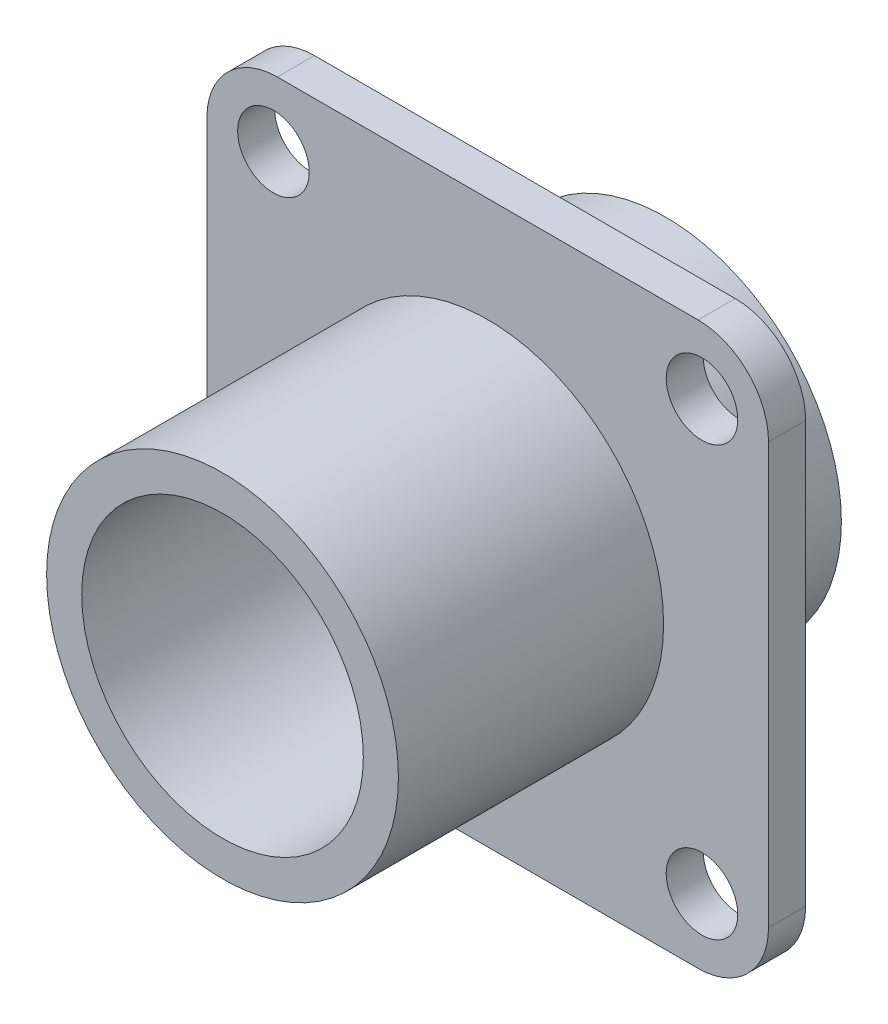
ISO-10303-21;
HEADER;
FILE_DESCRIPTION(('STEP AP214'),'2;1');
FILE_NAME('part.step','',(''),(''),'','','');
FILE_SCHEMA(('AUTOMOTIVE_DESIGN { 1 0 10303 214 1 1 1 1 }'));
ENDSEC;
DATA;
#1=APPLICATION_CONTEXT('core data for automotive mechanical design processes');
#2=APPLICATION_PROTOCOL_DEFINITION('international standard','automotive_design',2000,#1);
#3=PRODUCT_CONTEXT('',#1,'mechanical');
#4=PRODUCT('Part','Part','',(#3));
#5=PRODUCT_RELATED_PRODUCT_CATEGORY('part','',(#4));
#6=PRODUCT_DEFINITION_FORMATION('','',#4);
#7=PRODUCT_DEFINITION_CONTEXT('part definition',#1,'design');
#8=PRODUCT_DEFINITION('design','',#6,#7);
#9=PRODUCT_DEFINITION_SHAPE('','',#8);
#10=(LENGTH_UNIT() NAMED_UNIT(*) SI_UNIT(.MILLI.,.METRE.));
#11=(NAMED_UNIT(*) PLANE_ANGLE_UNIT() SI_UNIT($,.RADIAN.));
#12=(NAMED_UNIT(*) SI_UNIT($,.STERADIAN.) SOLID_ANGLE_UNIT());
#13=UNCERTAINTY_MEASURE_WITH_UNIT(LENGTH_MEASURE(1.E-05),#10,'distance_accuracy_value','');
#14=(GEOMETRIC_REPRESENTATION_CONTEXT(3) GLOBAL_UNCERTAINTY_ASSIGNED_CONTEXT((#13)) GLOBAL_UNIT_ASSIGNED_CONTEXT((#10,
#11,#12)) REPRESENTATION_CONTEXT('',''));
#15=CARTESIAN_POINT('',(0.,0.,0.));
#16=DIRECTION('',(0.,0.,1.));
#17=DIRECTION('',(1.,0.,0.));
#18=AXIS2_PLACEMENT_3D('',#15,#16,#17);
#19=CARTESIAN_POINT('',(0.,0.,0.));
#20=DIRECTION('',(0.,0.,-1.));
#21=DIRECTION('',(-1.,0.,0.));
#22=AXIS2_PLACEMENT_3D('',#19,#20,#21);
#23=CYLINDRICAL_SURFACE('',#22,7.49);
#24=CARTESIAN_POINT('',(0.,0.,0.));
#25=DIRECTION('',(0.,0.,-1.));
#26=DIRECTION('',(-1.,0.,0.));
#27=AXIS2_PLACEMENT_3D('',#24,#25,#26);
#28=CIRCLE('',#27,7.49);
#29=CARTESIAN_POINT('',(-7.49,0.,0.));
#30=VERTEX_POINT('',#29);
#31=EDGE_CURVE('E134',#30,#30,#28,.T.);
#32=ORIENTED_EDGE('',*,*,#31,.T.);
#33=EDGE_LOOP('',(#32));
#34=FACE_BOUND('',#33,.T.);
#35=CARTESIAN_POINT('',(0.,0.,-6.));
#36=DIRECTION('',(0.,0.,-1.));
#37=DIRECTION('',(-1.,0.,0.));
#38=AXIS2_PLACEMENT_3D('',#35,#36,#37);
#39=CIRCLE('',#38,7.49);
#40=CARTESIAN_POINT('',(-7.49,0.,-6.));
#41=VERTEX_POINT('',#40);
#42=EDGE_CURVE('E218',#41,#41,#39,.T.);
#43=ORIENTED_EDGE('',*,*,#42,.F.);
#44=EDGE_LOOP('',(#43));
#45=FACE_BOUND('',#44,.T.);
#46=ADVANCED_FACE('F41',(#34,#45),#23,.T.);
#47=CARTESIAN_POINT('',(0.,0.,12.88));
#48=DIRECTION('',(0.,0.,1.));
#49=DIRECTION('',(1.,0.,0.));
#50=AXIS2_PLACEMENT_3D('',#47,#48,#49);
#51=CYLINDRICAL_SURFACE('',#50,5.99999999999999);
#52=CARTESIAN_POINT('',(0.,0.,12.88));
#53=DIRECTION('',(0.,0.,1.));
#54=DIRECTION('',(1.,0.,0.));
#55=AXIS2_PLACEMENT_3D('',#52,#53,#54);
#56=CIRCLE('',#55,5.99999999999999);
#57=CARTESIAN_POINT('',(5.99999999999999,0.,12.88));
#58=VERTEX_POINT('',#57);
#59=EDGE_CURVE('E215',#58,#58,#56,.T.);
#60=ORIENTED_EDGE('',*,*,#59,.T.);
#61=EDGE_LOOP('',(#60));
#62=FACE_BOUND('',#61,.T.);
#63=CARTESIAN_POINT('',(0.,0.,-6.));
#64=DIRECTION('',(0.,0.,-1.));
#65=DIRECTION('',(-1.,0.,0.));
#66=AXIS2_PLACEMENT_3D('',#63,#64,#65);
#67=CIRCLE('',#66,5.99999999999999);
#68=CARTESIAN_POINT('',(-5.99999999999999,0.,-6.));
#69=VERTEX_POINT('',#68);
#70=EDGE_CURVE('E45',#69,#69,#67,.F.);
#71=ORIENTED_EDGE('',*,*,#70,.F.);
#72=EDGE_LOOP('',(#71));
#73=FACE_BOUND('',#72,.T.);
#74=ADVANCED_FACE('F227',(#62,#73),#51,.F.);
#75=CARTESIAN_POINT('',(11.965,-11.965,1.58));
#76=DIRECTION('',(0.,-1.,0.));
#77=DIRECTION('',(1.,0.,0.));
#78=AXIS2_PLACEMENT_3D('',#75,#76,#77);
#79=PLANE('',#78);
#80=DIRECTION('',(-1.,0.,0.));
#81=VECTOR('',#80,1.);
#82=CARTESIAN_POINT('',(11.965,-11.965,1.58));
#83=LINE('',#82,#81);
#84=CARTESIAN_POINT('',(8.965,-11.965,1.58));
#85=VERTEX_POINT('',#84);
#86=CARTESIAN_POINT('',(-8.96499999999999,-11.965,1.58));
#87=VERTEX_POINT('',#86);
#88=EDGE_CURVE('E167',#85,#87,#83,.T.);
#89=ORIENTED_EDGE('',*,*,#88,.T.);
#90=DIRECTION('',(0.,0.,-1.));
#91=VECTOR('',#90,1.);
#92=CARTESIAN_POINT('',(-8.96499999999999,-11.965,1.58));
#93=LINE('',#92,#91);
#94=CARTESIAN_POINT('',(-8.96499999999999,-11.965,0.));
#95=VERTEX_POINT('',#94);
#96=EDGE_CURVE('E12',#87,#95,#93,.T.);
#97=ORIENTED_EDGE('',*,*,#96,.T.);
#98=DIRECTION('',(-1.,0.,0.));
#99=VECTOR('',#98,1.);
#100=CARTESIAN_POINT('',(11.965,-11.965,0.));
#101=LINE('',#100,#99);
#102=CARTESIAN_POINT('',(8.965,-11.965,0.));
#103=VERTEX_POINT('',#102);
#104=EDGE_CURVE('E114',#103,#95,#101,.T.);
#105=ORIENTED_EDGE('',*,*,#104,.F.);
#106=DIRECTION('',(0.,0.,-1.));
#107=VECTOR('',#106,1.);
#108=CARTESIAN_POINT('',(8.965,-11.965,1.58));
#109=LINE('',#108,#107);
#110=EDGE_CURVE('E50',#103,#85,#109,.F.);
#111=ORIENTED_EDGE('',*,*,#110,.T.);
#112=EDGE_LOOP('',(#89,#97,#105,#111));
#113=FACE_BOUND('',#112,.T.);
#114=ADVANCED_FACE('F166',(#113),#79,.T.);
#115=CARTESIAN_POINT('',(11.965,11.965,1.58));
#116=DIRECTION('',(1.,0.,0.));
#117=DIRECTION('',(0.,1.,0.));
#118=AXIS2_PLACEMENT_3D('',#115,#116,#117);
#119=PLANE('',#118);
#120=DIRECTION('',(0.,-1.,0.));
#121=VECTOR('',#120,1.);
#122=CARTESIAN_POINT('',(11.965,11.965,0.));
#123=LINE('',#122,#121);
#124=CARTESIAN_POINT('',(11.965,8.965,0.));
#125=VERTEX_POINT('',#124);
#126=CARTESIAN_POINT('',(11.965,-8.96499999999999,0.));
#127=VERTEX_POINT('',#126);
#128=EDGE_CURVE('E141',#125,#127,#123,.T.);
#129=ORIENTED_EDGE('',*,*,#128,.F.);
#130=DIRECTION('',(0.,0.,-1.));
#131=VECTOR('',#130,1.);
#132=CARTESIAN_POINT('',(11.965,8.965,1.58));
#133=LINE('',#132,#131);
#134=CARTESIAN_POINT('',(11.965,8.965,1.58));
#135=VERTEX_POINT('',#134);
#136=EDGE_CURVE('E64',#125,#135,#133,.F.);
#137=ORIENTED_EDGE('',*,*,#136,.T.);
#138=DIRECTION('',(0.,-1.,0.));
#139=VECTOR('',#138,1.);
#140=CARTESIAN_POINT('',(11.965,11.965,1.58));
#141=LINE('',#140,#139);
#142=CARTESIAN_POINT('',(11.965,-8.96499999999999,1.58));
#143=VERTEX_POINT('',#142);
#144=EDGE_CURVE('E176',#135,#143,#141,.T.);
#145=ORIENTED_EDGE('',*,*,#144,.T.);
#146=DIRECTION('',(0.,0.,-1.));
#147=VECTOR('',#146,1.);
#148=CARTESIAN_POINT('',(11.965,-8.965,1.58));
#149=LINE('',#148,#147);
#150=EDGE_CURVE('E159',#143,#127,#149,.T.);
#151=ORIENTED_EDGE('',*,*,#150,.T.);
#152=EDGE_LOOP('',(#129,#137,#145,#151));
#153=FACE_BOUND('',#152,.T.);
#154=ADVANCED_FACE('F175',(#153),#119,.T.);
#155=CARTESIAN_POINT('',(-11.965,11.965,1.58));
#156=DIRECTION('',(0.,1.,0.));
#157=DIRECTION('',(-1.,0.,0.));
#158=AXIS2_PLACEMENT_3D('',#155,#156,#157);
#159=PLANE('',#158);
#160=DIRECTION('',(1.,0.,0.));
#161=VECTOR('',#160,1.);
#162=CARTESIAN_POINT('',(-11.965,11.965,0.));
#163=LINE('',#162,#161);
#164=CARTESIAN_POINT('',(-8.965,11.965,0.));
#165=VERTEX_POINT('',#164);
#166=CARTESIAN_POINT('',(8.96499999999999,11.965,0.));
#167=VERTEX_POINT('',#166);
#168=EDGE_CURVE('E129',#165,#167,#163,.T.);
#169=ORIENTED_EDGE('',*,*,#168,.F.);
#170=DIRECTION('',(0.,0.,-1.));
#171=VECTOR('',#170,1.);
#172=CARTESIAN_POINT('',(-8.965,11.965,1.58));
#173=LINE('',#172,#171);
#174=CARTESIAN_POINT('',(-8.965,11.965,1.58));
#175=VERTEX_POINT('',#174);
#176=EDGE_CURVE('E151',#165,#175,#173,.F.);
#177=ORIENTED_EDGE('',*,*,#176,.T.);
#178=DIRECTION('',(1.,0.,0.));
#179=VECTOR('',#178,1.);
#180=CARTESIAN_POINT('',(-11.965,11.965,1.58));
#181=LINE('',#180,#179);
#182=CARTESIAN_POINT('',(8.96499999999999,11.965,1.58));
#183=VERTEX_POINT('',#182);
#184=EDGE_CURVE('E183',#175,#183,#181,.T.);
#185=ORIENTED_EDGE('',*,*,#184,.T.);
#186=DIRECTION('',(0.,0.,-1.));
#187=VECTOR('',#186,1.);
#188=CARTESIAN_POINT('',(8.96499999999999,11.965,1.58));
#189=LINE('',#188,#187);
#190=EDGE_CURVE('E148',#183,#167,#189,.T.);
#191=ORIENTED_EDGE('',*,*,#190,.T.);
#192=EDGE_LOOP('',(#169,#177,#185,#191));
#193=FACE_BOUND('',#192,.T.);
#194=ADVANCED_FACE('F273',(#193),#159,.T.);
#195=CARTESIAN_POINT('',(-11.965,-11.965,1.58));
#196=DIRECTION('',(-1.,0.,0.));
#197=DIRECTION('',(0.,-1.,0.));
#198=AXIS2_PLACEMENT_3D('',#195,#196,#197);
#199=PLANE('',#198);
#200=DIRECTION('',(0.,1.,0.));
#201=VECTOR('',#200,1.);
#202=CARTESIAN_POINT('',(-11.965,-11.965,1.58));
#203=LINE('',#202,#201);
#204=CARTESIAN_POINT('',(-11.965,-8.965,1.58));
#205=VERTEX_POINT('',#204);
#206=CARTESIAN_POINT('',(-11.965,8.96499999999998,1.58));
#207=VERTEX_POINT('',#206);
#208=EDGE_CURVE('E171',#205,#207,#203,.T.);
#209=ORIENTED_EDGE('',*,*,#208,.T.);
#210=DIRECTION('',(0.,0.,-1.));
#211=VECTOR('',#210,1.);
#212=CARTESIAN_POINT('',(-11.965,8.96499999999999,1.58));
#213=LINE('',#212,#211);
#214=CARTESIAN_POINT('',(-11.965,8.96499999999998,0.));
#215=VERTEX_POINT('',#214);
#216=EDGE_CURVE('E128',#207,#215,#213,.T.);
#217=ORIENTED_EDGE('',*,*,#216,.T.);
#218=DIRECTION('',(0.,1.,0.));
#219=VECTOR('',#218,1.);
#220=CARTESIAN_POINT('',(-11.965,-11.965,0.));
#221=LINE('',#220,#219);
#222=CARTESIAN_POINT('',(-11.965,-8.965,0.));
#223=VERTEX_POINT('',#222);
#224=EDGE_CURVE('E112',#223,#215,#221,.T.);
#225=ORIENTED_EDGE('',*,*,#224,.F.);
#226=DIRECTION('',(0.,0.,-1.));
#227=VECTOR('',#226,1.);
#228=CARTESIAN_POINT('',(-11.965,-8.965,1.58));
#229=LINE('',#228,#227);
#230=EDGE_CURVE('E125',#223,#205,#229,.F.);
#231=ORIENTED_EDGE('',*,*,#230,.T.);
#232=EDGE_LOOP('',(#209,#217,#225,#231));
#233=FACE_BOUND('',#232,.T.);
#234=ADVANCED_FACE('F124',(#233),#199,.T.);
#235=CARTESIAN_POINT('',(0.,0.,1.58));
#236=DIRECTION('',(0.,0.,-1.));
#237=DIRECTION('',(-1.,0.,0.));
#238=AXIS2_PLACEMENT_3D('',#235,#236,#237);
#239=PLANE('',#238);
#240=CARTESIAN_POINT('',(-9.13,-9.13,1.58));
#241=DIRECTION('',(0.,0.,-1.));
#242=DIRECTION('',(-1.,0.,0.));
#243=AXIS2_PLACEMENT_3D('',#240,#241,#242);
#244=CIRCLE('',#243,1.52499999999999);
#245=CARTESIAN_POINT('',(-10.655,-9.13,1.58));
#246=VERTEX_POINT('',#245);
#247=EDGE_CURVE('E209',#246,#246,#244,.T.);
#248=ORIENTED_EDGE('',*,*,#247,.T.);
#249=EDGE_LOOP('',(#248));
#250=FACE_BOUND('',#249,.T.);
#251=CARTESIAN_POINT('',(-9.13,9.13,1.58));
#252=DIRECTION('',(0.,0.,-1.));
#253=DIRECTION('',(-1.,0.,0.));
#254=AXIS2_PLACEMENT_3D('',#251,#252,#253);
#255=CIRCLE('',#254,1.52499999999999);
#256=CARTESIAN_POINT('',(-10.655,9.13,1.58));
#257=VERTEX_POINT('',#256);
#258=EDGE_CURVE('E203',#257,#257,#255,.T.);
#259=ORIENTED_EDGE('',*,*,#258,.T.);
#260=EDGE_LOOP('',(#259));
#261=FACE_BOUND('',#260,.T.);
#262=CARTESIAN_POINT('',(9.13,9.13,1.58));
#263=DIRECTION('',(0.,0.,-1.));
#264=DIRECTION('',(-1.,0.,0.));
#265=AXIS2_PLACEMENT_3D('',#262,#263,#264);
#266=CIRCLE('',#265,1.52499999999999);
#267=CARTESIAN_POINT('',(7.60500000000001,9.13,1.58));
#268=VERTEX_POINT('',#267);
#269=EDGE_CURVE('E197',#268,#268,#266,.T.);
#270=ORIENTED_EDGE('',*,*,#269,.T.);
#271=EDGE_LOOP('',(#270));
#272=FACE_BOUND('',#271,.T.);
#273=CARTESIAN_POINT('',(9.13,-9.13,1.58));
#274=DIRECTION('',(0.,0.,-1.));
#275=DIRECTION('',(-1.,0.,0.));
#276=AXIS2_PLACEMENT_3D('',#273,#274,#275);
#277=CIRCLE('',#276,1.52499999999999);
#278=CARTESIAN_POINT('',(7.60500000000001,-9.13,1.58));
#279=VERTEX_POINT('',#278);
#280=EDGE_CURVE('E190',#279,#279,#277,.T.);
#281=ORIENTED_EDGE('',*,*,#280,.T.);
#282=EDGE_LOOP('',(#281));
#283=FACE_BOUND('',#282,.T.);
#284=CARTESIAN_POINT('',(0.,0.,1.58));
#285=DIRECTION('',(0.,0.,1.));
#286=DIRECTION('',(1.,0.,0.));
#287=AXIS2_PLACEMENT_3D('',#284,#285,#286);
#288=CIRCLE('',#287,7.495);
#289=CARTESIAN_POINT('',(7.495,0.,1.58));
#290=VERTEX_POINT('',#289);
#291=EDGE_CURVE('E138',#290,#290,#288,.T.);
#292=ORIENTED_EDGE('',*,*,#291,.F.);
#293=EDGE_LOOP('',(#292));
#294=FACE_BOUND('',#293,.T.);
#295=ORIENTED_EDGE('',*,*,#184,.F.);
#296=CARTESIAN_POINT('',(-8.965,8.96499999999999,1.58));
#297=DIRECTION('',(0.,0.,-1.));
#298=DIRECTION('',(-1.,0.,0.));
#299=AXIS2_PLACEMENT_3D('',#296,#297,#298);
#300=CIRCLE('',#299,3.);
#301=EDGE_CURVE('E157',#175,#207,#300,.F.);
#302=ORIENTED_EDGE('',*,*,#301,.T.);
#303=ORIENTED_EDGE('',*,*,#208,.F.);
#304=CARTESIAN_POINT('',(-8.96499999999999,-8.965,1.58));
#305=DIRECTION('',(0.,0.,-1.));
#306=DIRECTION('',(-1.,0.,0.));
#307=AXIS2_PLACEMENT_3D('',#304,#305,#306);
#308=CIRCLE('',#307,3.);
#309=EDGE_CURVE('E133',#205,#87,#308,.F.);
#310=ORIENTED_EDGE('',*,*,#309,.T.);
#311=ORIENTED_EDGE('',*,*,#88,.F.);
#312=CARTESIAN_POINT('',(8.965,-8.965,1.58));
#313=DIRECTION('',(0.,0.,-1.));
#314=DIRECTION('',(-1.,0.,0.));
#315=AXIS2_PLACEMENT_3D('',#312,#313,#314);
#316=CIRCLE('',#315,3.);
#317=EDGE_CURVE('E57',#85,#143,#316,.F.);
#318=ORIENTED_EDGE('',*,*,#317,.T.);
#319=ORIENTED_EDGE('',*,*,#144,.F.);
#320=CARTESIAN_POINT('',(8.96499999999999,8.965,1.58));
#321=DIRECTION('',(0.,0.,-1.));
#322=DIRECTION('',(-1.,0.,0.));
#323=AXIS2_PLACEMENT_3D('',#320,#321,#322);
#324=CIRCLE('',#323,3.);
#325=EDGE_CURVE('E155',#135,#183,#324,.F.);
#326=ORIENTED_EDGE('',*,*,#325,.T.);
#327=EDGE_LOOP('',(#295,#302,#303,#310,#311,#318,#319,#326));
#328=FACE_BOUND('',#327,.T.);
#329=ADVANCED_FACE('F170',(#250,#261,#272,#283,#294,#328),#239,.F.);
#330=CARTESIAN_POINT('',(0.,0.,0.));
#331=DIRECTION('',(0.,0.,-1.));
#332=DIRECTION('',(-1.,0.,0.));
#333=AXIS2_PLACEMENT_3D('',#330,#331,#332);
#334=PLANE('',#333);
#335=CARTESIAN_POINT('',(-9.13,-9.13,0.));
#336=DIRECTION('',(0.,0.,-1.));
#337=DIRECTION('',(-1.,0.,0.));
#338=AXIS2_PLACEMENT_3D('',#335,#336,#337);
#339=CIRCLE('',#338,1.52499999999999);
#340=CARTESIAN_POINT('',(-10.655,-9.13,0.));
#341=VERTEX_POINT('',#340);
#342=EDGE_CURVE('E212',#341,#341,#339,.T.);
#343=ORIENTED_EDGE('',*,*,#342,.F.);
#344=EDGE_LOOP('',(#343));
#345=FACE_BOUND('',#344,.T.);
#346=CARTESIAN_POINT('',(-9.13,9.13,0.));
#347=DIRECTION('',(0.,0.,-1.));
#348=DIRECTION('',(-1.,0.,0.));
#349=AXIS2_PLACEMENT_3D('',#346,#347,#348);
#350=CIRCLE('',#349,1.52499999999999);
#351=CARTESIAN_POINT('',(-10.655,9.13,0.));
#352=VERTEX_POINT('',#351);
#353=EDGE_CURVE('E206',#352,#352,#350,.T.);
#354=ORIENTED_EDGE('',*,*,#353,.F.);
#355=EDGE_LOOP('',(#354));
#356=FACE_BOUND('',#355,.T.);
#357=CARTESIAN_POINT('',(9.13,9.13,0.));
#358=DIRECTION('',(0.,0.,-1.));
#359=DIRECTION('',(-1.,0.,0.));
#360=AXIS2_PLACEMENT_3D('',#357,#358,#359);
#361=CIRCLE('',#360,1.52499999999999);
#362=CARTESIAN_POINT('',(7.60500000000001,9.13,0.));
#363=VERTEX_POINT('',#362);
#364=EDGE_CURVE('E200',#363,#363,#361,.T.);
#365=ORIENTED_EDGE('',*,*,#364,.F.);
#366=EDGE_LOOP('',(#365));
#367=FACE_BOUND('',#366,.T.);
#368=CARTESIAN_POINT('',(9.13,-9.13,0.));
#369=DIRECTION('',(0.,0.,-1.));
#370=DIRECTION('',(-1.,0.,0.));
#371=AXIS2_PLACEMENT_3D('',#368,#369,#370);
#372=CIRCLE('',#371,1.52499999999999);
#373=CARTESIAN_POINT('',(7.60500000000001,-9.13,0.));
#374=VERTEX_POINT('',#373);
#375=EDGE_CURVE('E194',#374,#374,#372,.T.);
#376=ORIENTED_EDGE('',*,*,#375,.F.);
#377=EDGE_LOOP('',(#376));
#378=FACE_BOUND('',#377,.T.);
#379=ORIENTED_EDGE('',*,*,#31,.F.);
#380=EDGE_LOOP('',(#379));
#381=FACE_BOUND('',#380,.T.);
#382=ORIENTED_EDGE('',*,*,#224,.T.);
#383=CARTESIAN_POINT('',(-8.965,8.96499999999999,0.));
#384=DIRECTION('',(0.,0.,-1.));
#385=DIRECTION('',(-1.,0.,0.));
#386=AXIS2_PLACEMENT_3D('',#383,#384,#385);
#387=CIRCLE('',#386,3.);
#388=EDGE_CURVE('E146',#215,#165,#387,.T.);
#389=ORIENTED_EDGE('',*,*,#388,.T.);
#390=ORIENTED_EDGE('',*,*,#168,.T.);
#391=CARTESIAN_POINT('',(8.96499999999999,8.965,0.));
#392=DIRECTION('',(0.,0.,-1.));
#393=DIRECTION('',(-1.,0.,0.));
#394=AXIS2_PLACEMENT_3D('',#391,#392,#393);
#395=CIRCLE('',#394,3.);
#396=EDGE_CURVE('E118',#167,#125,#395,.T.);
#397=ORIENTED_EDGE('',*,*,#396,.T.);
#398=ORIENTED_EDGE('',*,*,#128,.T.);
#399=CARTESIAN_POINT('',(8.965,-8.965,0.));
#400=DIRECTION('',(0.,0.,-1.));
#401=DIRECTION('',(-1.,0.,0.));
#402=AXIS2_PLACEMENT_3D('',#399,#400,#401);
#403=CIRCLE('',#402,3.);
#404=EDGE_CURVE('E119',#127,#103,#403,.T.);
#405=ORIENTED_EDGE('',*,*,#404,.T.);
#406=ORIENTED_EDGE('',*,*,#104,.T.);
#407=CARTESIAN_POINT('',(-8.96499999999999,-8.965,0.));
#408=DIRECTION('',(0.,0.,-1.));
#409=DIRECTION('',(-1.,0.,0.));
#410=AXIS2_PLACEMENT_3D('',#407,#408,#409);
#411=CIRCLE('',#410,3.);
#412=EDGE_CURVE('E109',#95,#223,#411,.T.);
#413=ORIENTED_EDGE('',*,*,#412,.T.);
#414=EDGE_LOOP('',(#382,#389,#390,#397,#398,#405,#406,#413));
#415=FACE_BOUND('',#414,.T.);
#416=ADVANCED_FACE('F111',(#345,#356,#367,#378,#381,#415),#334,.T.);
#417=CARTESIAN_POINT('',(0.,0.,1.58));
#418=DIRECTION('',(0.,0.,1.));
#419=DIRECTION('',(1.,0.,0.));
#420=AXIS2_PLACEMENT_3D('',#417,#418,#419);
#421=CYLINDRICAL_SURFACE('',#420,7.495);
#422=ORIENTED_EDGE('',*,*,#291,.T.);
#423=EDGE_LOOP('',(#422));
#424=FACE_BOUND('',#423,.T.);
#425=CARTESIAN_POINT('',(0.,0.,12.88));
#426=DIRECTION('',(0.,0.,1.));
#427=DIRECTION('',(1.,0.,0.));
#428=AXIS2_PLACEMENT_3D('',#425,#426,#427);
#429=CIRCLE('',#428,7.495);
#430=CARTESIAN_POINT('',(7.495,0.,12.88));
#431=VERTEX_POINT('',#430);
#432=EDGE_CURVE('E181',#431,#431,#429,.T.);
#433=ORIENTED_EDGE('',*,*,#432,.F.);
#434=EDGE_LOOP('',(#433));
#435=FACE_BOUND('',#434,.T.);
#436=ADVANCED_FACE('F260',(#424,#435),#421,.T.);
#437=CARTESIAN_POINT('',(0.,0.,12.88));
#438=DIRECTION('',(0.,0.,1.));
#439=DIRECTION('',(1.,0.,0.));
#440=AXIS2_PLACEMENT_3D('',#437,#438,#439);
#441=PLANE('',#440);
#442=ORIENTED_EDGE('',*,*,#59,.F.);
#443=EDGE_LOOP('',(#442));
#444=FACE_BOUND('',#443,.T.);
#445=ORIENTED_EDGE('',*,*,#432,.T.);
#446=EDGE_LOOP('',(#445));
#447=FACE_BOUND('',#446,.T.);
#448=ADVANCED_FACE('F255',(#444,#447),#441,.T.);
#449=CARTESIAN_POINT('',(9.13,-9.13,0.));
#450=DIRECTION('',(0.,0.,-1.));
#451=DIRECTION('',(-1.,0.,0.));
#452=AXIS2_PLACEMENT_3D('',#449,#450,#451);
#453=CYLINDRICAL_SURFACE('',#452,1.52499999999999);
#454=ORIENTED_EDGE('',*,*,#375,.T.);
#455=EDGE_LOOP('',(#454));
#456=FACE_BOUND('',#455,.T.);
#457=ORIENTED_EDGE('',*,*,#280,.F.);
#458=EDGE_LOOP('',(#457));
#459=FACE_BOUND('',#458,.T.);
#460=ADVANCED_FACE('F252',(#456,#459),#453,.F.);
#461=CARTESIAN_POINT('',(9.13,9.13,0.));
#462=DIRECTION('',(0.,0.,-1.));
#463=DIRECTION('',(-1.,0.,0.));
#464=AXIS2_PLACEMENT_3D('',#461,#462,#463);
#465=CYLINDRICAL_SURFACE('',#464,1.52499999999999);
#466=ORIENTED_EDGE('',*,*,#364,.T.);
#467=EDGE_LOOP('',(#466));
#468=FACE_BOUND('',#467,.T.);
#469=ORIENTED_EDGE('',*,*,#269,.F.);
#470=EDGE_LOOP('',(#469));
#471=FACE_BOUND('',#470,.T.);
#472=ADVANCED_FACE('F248',(#468,#471),#465,.F.);
#473=CARTESIAN_POINT('',(-9.13,9.13,0.));
#474=DIRECTION('',(0.,0.,-1.));
#475=DIRECTION('',(-1.,0.,0.));
#476=AXIS2_PLACEMENT_3D('',#473,#474,#475);
#477=CYLINDRICAL_SURFACE('',#476,1.52499999999999);
#478=ORIENTED_EDGE('',*,*,#353,.T.);
#479=EDGE_LOOP('',(#478));
#480=FACE_BOUND('',#479,.T.);
#481=ORIENTED_EDGE('',*,*,#258,.F.);
#482=EDGE_LOOP('',(#481));
#483=FACE_BOUND('',#482,.T.);
#484=ADVANCED_FACE('F244',(#480,#483),#477,.F.);
#485=CARTESIAN_POINT('',(-9.13,-9.13,0.));
#486=DIRECTION('',(0.,0.,-1.));
#487=DIRECTION('',(-1.,0.,0.));
#488=AXIS2_PLACEMENT_3D('',#485,#486,#487);
#489=CYLINDRICAL_SURFACE('',#488,1.52499999999999);
#490=ORIENTED_EDGE('',*,*,#342,.T.);
#491=EDGE_LOOP('',(#490));
#492=FACE_BOUND('',#491,.T.);
#493=ORIENTED_EDGE('',*,*,#247,.F.);
#494=EDGE_LOOP('',(#493));
#495=FACE_BOUND('',#494,.T.);
#496=ADVANCED_FACE('F240',(#492,#495),#489,.F.);
#497=CARTESIAN_POINT('',(-8.965,8.96499999999999,1.58));
#498=DIRECTION('',(0.,0.,-1.));
#499=DIRECTION('',(-1.,0.,0.));
#500=AXIS2_PLACEMENT_3D('',#497,#498,#499);
#501=CYLINDRICAL_SURFACE('',#500,3.);
#502=ORIENTED_EDGE('',*,*,#301,.F.);
#503=ORIENTED_EDGE('',*,*,#176,.F.);
#504=ORIENTED_EDGE('',*,*,#388,.F.);
#505=ORIENTED_EDGE('',*,*,#216,.F.);
#506=EDGE_LOOP('',(#502,#503,#504,#505));
#507=FACE_BOUND('',#506,.T.);
#508=ADVANCED_FACE('F243',(#507),#501,.T.);
#509=CARTESIAN_POINT('',(8.96499999999999,8.965,1.58));
#510=DIRECTION('',(0.,0.,-1.));
#511=DIRECTION('',(-1.,0.,0.));
#512=AXIS2_PLACEMENT_3D('',#509,#510,#511);
#513=CYLINDRICAL_SURFACE('',#512,3.);
#514=ORIENTED_EDGE('',*,*,#325,.F.);
#515=ORIENTED_EDGE('',*,*,#136,.F.);
#516=ORIENTED_EDGE('',*,*,#396,.F.);
#517=ORIENTED_EDGE('',*,*,#190,.F.);
#518=EDGE_LOOP('',(#514,#515,#516,#517));
#519=FACE_BOUND('',#518,.T.);
#520=ADVANCED_FACE('F281',(#519),#513,.T.);
#521=CARTESIAN_POINT('',(-8.96499999999999,-8.965,1.58));
#522=DIRECTION('',(0.,0.,-1.));
#523=DIRECTION('',(-1.,0.,0.));
#524=AXIS2_PLACEMENT_3D('',#521,#522,#523);
#525=CYLINDRICAL_SURFACE('',#524,3.);
#526=ORIENTED_EDGE('',*,*,#309,.F.);
#527=ORIENTED_EDGE('',*,*,#230,.F.);
#528=ORIENTED_EDGE('',*,*,#412,.F.);
#529=ORIENTED_EDGE('',*,*,#96,.F.);
#530=EDGE_LOOP('',(#526,#527,#528,#529));
#531=FACE_BOUND('',#530,.T.);
#532=ADVANCED_FACE('F132',(#531),#525,.T.);
#533=CARTESIAN_POINT('',(8.965,-8.965,1.58));
#534=DIRECTION('',(0.,0.,-1.));
#535=DIRECTION('',(-1.,0.,0.));
#536=AXIS2_PLACEMENT_3D('',#533,#534,#535);
#537=CYLINDRICAL_SURFACE('',#536,3.);
#538=ORIENTED_EDGE('',*,*,#317,.F.);
#539=ORIENTED_EDGE('',*,*,#110,.F.);
#540=ORIENTED_EDGE('',*,*,#404,.F.);
#541=ORIENTED_EDGE('',*,*,#150,.F.);
#542=EDGE_LOOP('',(#538,#539,#540,#541));
#543=FACE_BOUND('',#542,.T.);
#544=ADVANCED_FACE('F43',(#543),#537,.T.);
#545=CARTESIAN_POINT('',(0.,0.,-6.));
#546=DIRECTION('',(0.,0.,-1.));
#547=DIRECTION('',(-1.,0.,0.));
#548=AXIS2_PLACEMENT_3D('',#545,#546,#547);
#549=PLANE('',#548);
#550=ORIENTED_EDGE('',*,*,#42,.T.);
#551=EDGE_LOOP('',(#550));
#552=FACE_BOUND('',#551,.T.);
#553=ORIENTED_EDGE('',*,*,#70,.T.);
#554=EDGE_LOOP('',(#553));
#555=FACE_BOUND('',#554,.T.);
#556=ADVANCED_FACE('F225',(#552,#555),#549,.T.);
#557=CLOSED_SHELL('',(#46,#74,#114,#154,#194,#234,#329,#416,#436,#448,#460,#472,#484,#496,#508,
#520,#532,#544,#556));
#558=MANIFOLD_SOLID_BREP('B2',#557);
#559=ADVANCED_BREP_SHAPE_REPRESENTATION('',(#18,#558),#14);
#560=SHAPE_DEFINITION_REPRESENTATION(#9,#559);
ENDSEC;
END-ISO-10303-21;
